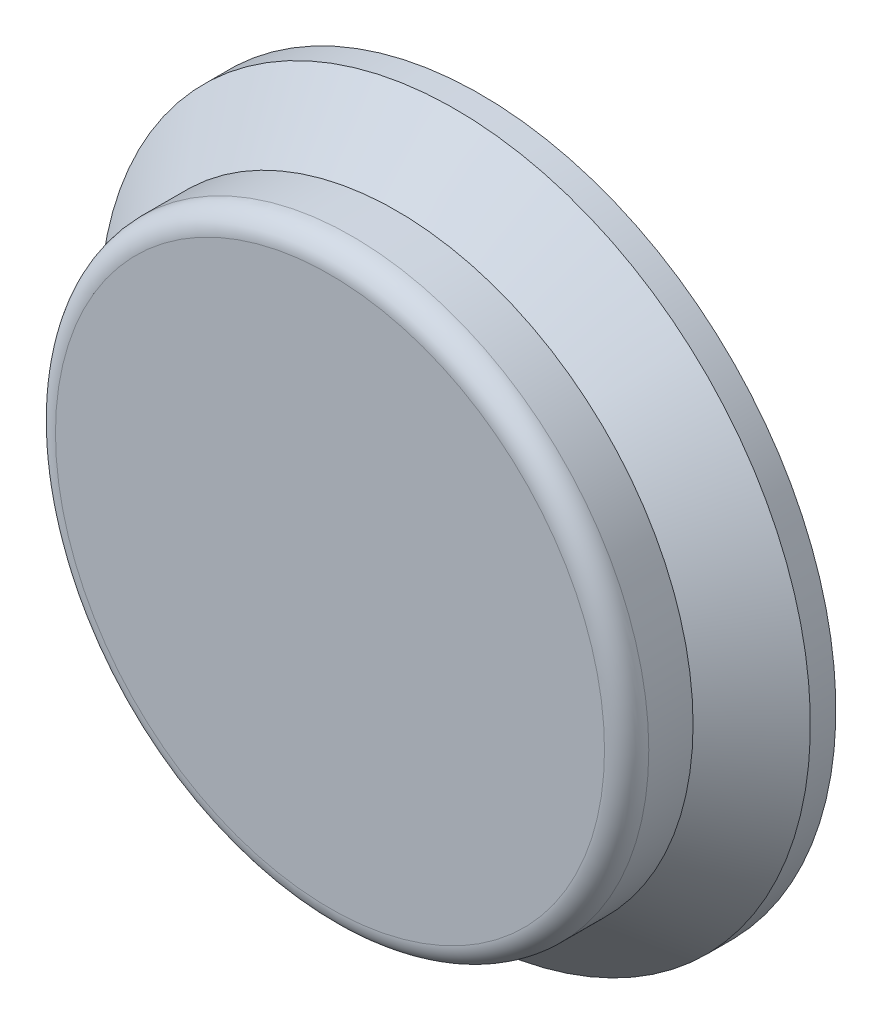
ISO-10303-21;
HEADER;
FILE_DESCRIPTION(('STEP AP214'),'2;1');
FILE_NAME('part.step','',(''),(''),'','','');
FILE_SCHEMA(('AUTOMOTIVE_DESIGN { 1 0 10303 214 1 1 1 1 }'));
ENDSEC;
DATA;
#1=APPLICATION_CONTEXT('core data for automotive mechanical design processes');
#2=APPLICATION_PROTOCOL_DEFINITION('international standard','automotive_design',2000,#1);
#3=PRODUCT_CONTEXT('',#1,'mechanical');
#4=PRODUCT('Part','Part','',(#3));
#5=PRODUCT_RELATED_PRODUCT_CATEGORY('part','',(#4));
#6=PRODUCT_DEFINITION_FORMATION('','',#4);
#7=PRODUCT_DEFINITION_CONTEXT('part definition',#1,'design');
#8=PRODUCT_DEFINITION('design','',#6,#7);
#9=PRODUCT_DEFINITION_SHAPE('','',#8);
#10=(LENGTH_UNIT() NAMED_UNIT(*) SI_UNIT(.MILLI.,.METRE.));
#11=(NAMED_UNIT(*) PLANE_ANGLE_UNIT() SI_UNIT($,.RADIAN.));
#12=(NAMED_UNIT(*) SI_UNIT($,.STERADIAN.) SOLID_ANGLE_UNIT());
#13=UNCERTAINTY_MEASURE_WITH_UNIT(LENGTH_MEASURE(1.E-05),#10,'distance_accuracy_value','');
#14=(GEOMETRIC_REPRESENTATION_CONTEXT(3) GLOBAL_UNCERTAINTY_ASSIGNED_CONTEXT((#13)) GLOBAL_UNIT_ASSIGNED_CONTEXT((#10,
#11,#12)) REPRESENTATION_CONTEXT('',''));
#15=CARTESIAN_POINT('',(0.,0.,0.));
#16=DIRECTION('',(0.,0.,1.));
#17=DIRECTION('',(1.,0.,0.));
#18=AXIS2_PLACEMENT_3D('',#15,#16,#17);
#19=CARTESIAN_POINT('',(0.,0.,3.8));
#20=DIRECTION('',(0.,0.,-1.));
#21=DIRECTION('',(-1.,0.,0.));
#22=AXIS2_PLACEMENT_3D('',#19,#20,#21);
#23=CYLINDRICAL_SURFACE('',#22,16.05);
#24=CARTESIAN_POINT('',(0.,0.,1.15000000000001));
#25=DIRECTION('',(0.,0.,1.));
#26=DIRECTION('',(1.,0.,0.));
#27=AXIS2_PLACEMENT_3D('',#24,#25,#26);
#28=CIRCLE('',#27,16.05);
#29=CARTESIAN_POINT('',(-16.05,0.,1.15000000000001));
#30=VERTEX_POINT('',#29);
#31=EDGE_CURVE('E64',#30,#30,#28,.F.);
#32=CARTESIAN_POINT('',(0.,0.,0.));
#33=DIRECTION('',(0.,0.,1.));
#34=DIRECTION('',(1.,0.,0.));
#35=AXIS2_PLACEMENT_3D('',#32,#33,#34);
#36=CIRCLE('',#35,16.05);
#37=CARTESIAN_POINT('',(-16.05,0.,0.));
#38=VERTEX_POINT('',#37);
#39=EDGE_CURVE('E69',#38,#38,#36,.T.);
#40=CARTESIAN_POINT('',(-16.05,0.,1.15000000000001));
#41=CARTESIAN_POINT('',(-16.05,0.,1.13802083333335));
#42=CARTESIAN_POINT('',(-16.05,0.,1.12604166666668));
#43=CARTESIAN_POINT('',(-16.05,0.,1.10208333333335));
#44=CARTESIAN_POINT('',(-16.05,0.,1.09010416666668));
#45=CARTESIAN_POINT('',(-16.05,0.,1.06614583333335));
#46=CARTESIAN_POINT('',(-16.05,0.,1.05416666666668));
#47=CARTESIAN_POINT('',(-16.05,0.,1.03020833333335));
#48=CARTESIAN_POINT('',(-16.05,0.,1.01822916666668));
#49=CARTESIAN_POINT('',(-16.05,0.,0.994270833333345));
#50=CARTESIAN_POINT('',(-16.05,0.,0.982291666666678));
#51=CARTESIAN_POINT('',(-16.05,0.,0.958333333333345));
#52=CARTESIAN_POINT('',(-16.05,0.,0.946354166666678));
#53=CARTESIAN_POINT('',(-16.05,0.,0.922395833333344));
#54=CARTESIAN_POINT('',(-16.05,0.,0.910416666666678));
#55=CARTESIAN_POINT('',(-16.05,0.,0.886458333333344));
#56=CARTESIAN_POINT('',(-16.05,0.,0.874479166666677));
#57=CARTESIAN_POINT('',(-16.05,0.,0.850520833333344));
#58=CARTESIAN_POINT('',(-16.05,0.,0.838541666666677));
#59=CARTESIAN_POINT('',(-16.05,0.,0.814583333333343));
#60=CARTESIAN_POINT('',(-16.05,0.,0.802604166666676));
#61=CARTESIAN_POINT('',(-16.05,0.,0.778645833333343));
#62=CARTESIAN_POINT('',(-16.05,0.,0.766666666666676));
#63=CARTESIAN_POINT('',(-16.05,0.,0.742708333333342));
#64=CARTESIAN_POINT('',(-16.05,0.,0.730729166666675));
#65=CARTESIAN_POINT('',(-16.05,0.,0.706770833333342));
#66=CARTESIAN_POINT('',(-16.05,0.,0.694791666666675));
#67=CARTESIAN_POINT('',(-16.05,0.,0.670833333333341));
#68=CARTESIAN_POINT('',(-16.05,0.,0.658854166666674));
#69=CARTESIAN_POINT('',(-16.05,0.,0.634895833333341));
#70=CARTESIAN_POINT('',(-16.05,0.,0.622916666666674));
#71=CARTESIAN_POINT('',(-16.05,0.,0.598958333333341));
#72=CARTESIAN_POINT('',(-16.05,0.,0.586979166666674));
#73=CARTESIAN_POINT('',(-16.05,0.,0.56302083333334));
#74=CARTESIAN_POINT('',(-16.05,0.,0.551041666666673));
#75=CARTESIAN_POINT('',(-16.05,0.,0.52708333333334));
#76=CARTESIAN_POINT('',(-16.05,0.,0.515104166666673));
#77=CARTESIAN_POINT('',(-16.05,0.,0.491145833333339));
#78=CARTESIAN_POINT('',(-16.05,0.,0.479166666666673));
#79=CARTESIAN_POINT('',(-16.05,0.,0.455208333333339));
#80=CARTESIAN_POINT('',(-16.05,0.,0.443229166666672));
#81=CARTESIAN_POINT('',(-16.05,0.,0.419270833333339));
#82=CARTESIAN_POINT('',(-16.05,0.,0.407291666666672));
#83=CARTESIAN_POINT('',(-16.05,0.,0.383333333333338));
#84=CARTESIAN_POINT('',(-16.05,0.,0.371354166666671));
#85=CARTESIAN_POINT('',(-16.05,0.,0.347395833333337));
#86=CARTESIAN_POINT('',(-16.05,0.,0.335416666666671));
#87=CARTESIAN_POINT('',(-16.05,0.,0.311458333333337));
#88=CARTESIAN_POINT('',(-16.05,0.,0.29947916666667));
#89=CARTESIAN_POINT('',(-16.05,0.,0.275520833333337));
#90=CARTESIAN_POINT('',(-16.05,0.,0.26354166666667));
#91=CARTESIAN_POINT('',(-16.05,0.,0.239583333333336));
#92=CARTESIAN_POINT('',(-16.05,0.,0.227604166666669));
#93=CARTESIAN_POINT('',(-16.05,0.,0.203645833333336));
#94=CARTESIAN_POINT('',(-16.05,0.,0.191666666666669));
#95=CARTESIAN_POINT('',(-16.05,0.,0.167708333333335));
#96=CARTESIAN_POINT('',(-16.05,0.,0.155729166666668));
#97=CARTESIAN_POINT('',(-16.05,0.,0.131770833333335));
#98=CARTESIAN_POINT('',(-16.05,0.,0.119791666666668));
#99=CARTESIAN_POINT('',(-16.05,0.,0.0958333333333344));
#100=CARTESIAN_POINT('',(-16.05,0.,0.0838541666666675));
#101=CARTESIAN_POINT('',(-16.05,0.,0.059895833333334));
#102=CARTESIAN_POINT('',(-16.05,0.,0.0479166666666672));
#103=CARTESIAN_POINT('',(-16.05,0.,0.0239583333333336));
#104=CARTESIAN_POINT('',(-16.05,0.,0.0119791666666668));
#105=CARTESIAN_POINT('',(-16.05,0.,0.));
#106=B_SPLINE_CURVE_WITH_KNOTS('',3,(#40,#41,#42,#43,#44,#45,#46,#47,#48,#49,#50,#51,#52,#53,
#54,#55,#56,#57,#58,#59,#60,#61,#62,#63,#64,#65,#66,#67,#68,#69,#70,#71,#72,#73,#74,#75,#76,#77,
#78,#79,#80,#81,#82,#83,#84,#85,#86,#87,#88,#89,#90,#91,#92,#93,#94,#95,#96,#97,#98,#99,#100,
#101,#102,#103,#104,#105),.UNSPECIFIED.,.F.,.F.,(4,2,2,2,2,2,2,2,2,2,2,2,2,2,2,2,2,2,2,2,2,2,2,
2,2,2,2,2,2,2,2,2,4),(0.,0.0359375000000004,0.0718750000000008,0.107812500000001,
0.143750000000002,0.179687500000002,0.215625000000003,0.251562500000003,0.287500000000003,
0.323437500000004,0.359375000000004,0.395312500000005,0.431250000000005,0.467187500000006,
0.503125000000006,0.539062500000007,0.575000000000007,0.610937500000007,0.646875000000008,
0.682812500000008,0.718750000000008,0.754687500000009,0.79062500000001,0.82656250000001,
0.86250000000001,0.898437500000011,0.934375000000011,0.970312500000012,1.00625000000001,
1.04218750000001,1.07812500000001,1.11406250000001,1.15000000000001),.UNSPECIFIED.);
#107=EDGE_CURVE('BSEAM39',#30,#38,#106,.T.);
#108=ORIENTED_EDGE('',*,*,#31,.T.);
#109=ORIENTED_EDGE('',*,*,#39,.T.);
#110=ORIENTED_EDGE('',*,*,#107,.T.);
#111=ORIENTED_EDGE('',*,*,#107,.F.);
#112=EDGE_LOOP('',(#108,#110,#109,#111));
#113=FACE_BOUND('',#112,.T.);
#114=ADVANCED_FACE('F39',(#113),#23,.T.);
#115=CARTESIAN_POINT('',(0.,0.,0.));
#116=DIRECTION('',(0.,0.,1.));
#117=DIRECTION('',(1.,0.,0.));
#118=AXIS2_PLACEMENT_3D('',#115,#116,#117);
#119=PLANE('',#118);
#120=CARTESIAN_POINT('',(0.,0.,0.));
#121=DIRECTION('',(0.,0.,1.));
#122=DIRECTION('',(1.,0.,0.));
#123=AXIS2_PLACEMENT_3D('',#120,#121,#122);
#124=CIRCLE('',#123,14.75);
#125=CARTESIAN_POINT('',(14.75,0.,0.));
#126=VERTEX_POINT('',#125);
#127=EDGE_CURVE('E10',#126,#126,#124,.T.);
#128=ORIENTED_EDGE('',*,*,#127,.T.);
#129=EDGE_LOOP('',(#128));
#130=FACE_BOUND('',#129,.T.);
#131=ORIENTED_EDGE('',*,*,#39,.F.);
#132=EDGE_LOOP('',(#131));
#133=FACE_BOUND('',#132,.T.);
#134=ADVANCED_FACE('F96',(#130,#133),#119,.F.);
#135=CARTESIAN_POINT('',(0.,0.,6.8));
#136=DIRECTION('',(0.,0.,-1.));
#137=DIRECTION('',(-1.,0.,0.));
#138=AXIS2_PLACEMENT_3D('',#135,#136,#137);
#139=CYLINDRICAL_SURFACE('',#138,13.4);
#140=CARTESIAN_POINT('',(0.,0.,5.8));
#141=DIRECTION('',(0.,0.,1.));
#142=DIRECTION('',(1.,0.,0.));
#143=AXIS2_PLACEMENT_3D('',#140,#141,#142);
#144=CIRCLE('',#143,13.4);
#145=CARTESIAN_POINT('',(13.4,0.,5.8));
#146=VERTEX_POINT('',#145);
#147=EDGE_CURVE('E53',#146,#146,#144,.F.);
#148=ORIENTED_EDGE('',*,*,#147,.T.);
#149=EDGE_LOOP('',(#148));
#150=FACE_BOUND('',#149,.T.);
#151=CARTESIAN_POINT('',(0.,0.,3.8));
#152=DIRECTION('',(0.,0.,1.));
#153=DIRECTION('',(1.,0.,0.));
#154=AXIS2_PLACEMENT_3D('',#151,#152,#153);
#155=CIRCLE('',#154,13.4);
#156=CARTESIAN_POINT('',(13.4,0.,3.8));
#157=VERTEX_POINT('',#156);
#158=EDGE_CURVE('E68',#157,#157,#155,.T.);
#159=ORIENTED_EDGE('',*,*,#158,.T.);
#160=EDGE_LOOP('',(#159));
#161=FACE_BOUND('',#160,.T.);
#162=ADVANCED_FACE('F102',(#150,#161),#139,.T.);
#163=CARTESIAN_POINT('',(0.,0.,6.8));
#164=DIRECTION('',(0.,0.,1.));
#165=DIRECTION('',(1.,0.,0.));
#166=AXIS2_PLACEMENT_3D('',#163,#164,#165);
#167=PLANE('',#166);
#168=CARTESIAN_POINT('',(0.,0.,6.8));
#169=DIRECTION('',(0.,0.,1.));
#170=DIRECTION('',(1.,0.,0.));
#171=AXIS2_PLACEMENT_3D('',#168,#169,#170);
#172=CIRCLE('',#171,12.4);
#173=CARTESIAN_POINT('',(12.4,0.,6.8));
#174=VERTEX_POINT('',#173);
#175=EDGE_CURVE('E58',#174,#174,#172,.T.);
#176=ORIENTED_EDGE('',*,*,#175,.T.);
#177=EDGE_LOOP('',(#176));
#178=FACE_BOUND('',#177,.T.);
#179=ADVANCED_FACE('F111',(#178),#167,.T.);
#180=CARTESIAN_POINT('',(0.,0.,3.8));
#181=DIRECTION('',(0.,0.,-1.));
#182=DIRECTION('',(-1.,0.,0.));
#183=AXIS2_PLACEMENT_3D('',#180,#181,#182);
#184=CONICAL_SURFACE('',#183,13.4,0.785398163397446);
#185=ORIENTED_EDGE('',*,*,#31,.F.);
#186=EDGE_LOOP('',(#185));
#187=FACE_BOUND('',#186,.T.);
#188=ORIENTED_EDGE('',*,*,#158,.F.);
#189=EDGE_LOOP('',(#188));
#190=FACE_BOUND('',#189,.T.);
#191=ADVANCED_FACE('F92',(#187,#190),#184,.T.);
#192=CARTESIAN_POINT('',(0.,0.,5.8));
#193=DIRECTION('',(0.,0.,1.));
#194=DIRECTION('',(1.,0.,0.));
#195=AXIS2_PLACEMENT_3D('',#192,#193,#194);
#196=TOROIDAL_SURFACE('',#195,12.4,1.);
#197=ORIENTED_EDGE('',*,*,#147,.F.);
#198=EDGE_LOOP('',(#197));
#199=FACE_BOUND('',#198,.T.);
#200=ORIENTED_EDGE('',*,*,#175,.F.);
#201=EDGE_LOOP('',(#200));
#202=FACE_BOUND('',#201,.T.);
#203=ADVANCED_FACE('F85',(#199,#202),#196,.T.);
#204=CARTESIAN_POINT('',(0.,0.,5.));
#205=DIRECTION('',(0.,0.,-1.));
#206=DIRECTION('',(-1.,0.,0.));
#207=AXIS2_PLACEMENT_3D('',#204,#205,#206);
#208=CYLINDRICAL_SURFACE('',#207,13.25);
#209=CARTESIAN_POINT('',(0.,0.,1.50000000000002));
#210=DIRECTION('',(0.,0.,1.));
#211=DIRECTION('',(1.,0.,0.));
#212=AXIS2_PLACEMENT_3D('',#209,#210,#211);
#213=CIRCLE('',#212,13.25);
#214=CARTESIAN_POINT('',(13.25,0.,1.50000000000002));
#215=VERTEX_POINT('',#214);
#216=EDGE_CURVE('E48',#215,#215,#213,.F.);
#217=ORIENTED_EDGE('',*,*,#216,.T.);
#218=EDGE_LOOP('',(#217));
#219=FACE_BOUND('',#218,.T.);
#220=CARTESIAN_POINT('',(0.,0.,5.));
#221=DIRECTION('',(0.,0.,-1.));
#222=DIRECTION('',(-1.,0.,0.));
#223=AXIS2_PLACEMENT_3D('',#220,#221,#222);
#224=CIRCLE('',#223,13.25);
#225=CARTESIAN_POINT('',(-13.25,0.,5.));
#226=VERTEX_POINT('',#225);
#227=EDGE_CURVE('E73',#226,#226,#224,.T.);
#228=ORIENTED_EDGE('',*,*,#227,.F.);
#229=EDGE_LOOP('',(#228));
#230=FACE_BOUND('',#229,.T.);
#231=ADVANCED_FACE('F83',(#219,#230),#208,.F.);
#232=CARTESIAN_POINT('',(0.,0.,5.));
#233=DIRECTION('',(0.,0.,-1.));
#234=DIRECTION('',(-1.,0.,0.));
#235=AXIS2_PLACEMENT_3D('',#232,#233,#234);
#236=PLANE('',#235);
#237=ORIENTED_EDGE('',*,*,#227,.T.);
#238=EDGE_LOOP('',(#237));
#239=FACE_BOUND('',#238,.T.);
#240=ADVANCED_FACE('F81',(#239),#236,.T.);
#241=CARTESIAN_POINT('',(0.,0.,1.50000000000002));
#242=DIRECTION('',(0.,0.,-1.));
#243=DIRECTION('',(-1.,0.,0.));
#244=AXIS2_PLACEMENT_3D('',#241,#242,#243);
#245=CONICAL_SURFACE('',#244,13.25,0.785398163397452);
#246=ORIENTED_EDGE('',*,*,#127,.F.);
#247=EDGE_LOOP('',(#246));
#248=FACE_BOUND('',#247,.T.);
#249=ORIENTED_EDGE('',*,*,#216,.F.);
#250=EDGE_LOOP('',(#249));
#251=FACE_BOUND('',#250,.T.);
#252=ADVANCED_FACE('F42',(#248,#251),#245,.F.);
#253=CLOSED_SHELL('',(#114,#134,#162,#179,#191,#203,#231,#240,#252));
#254=MANIFOLD_SOLID_BREP('B2',#253);
#255=ADVANCED_BREP_SHAPE_REPRESENTATION('',(#18,#254),#14);
#256=SHAPE_DEFINITION_REPRESENTATION(#9,#255);
ENDSEC;
END-ISO-10303-21;
